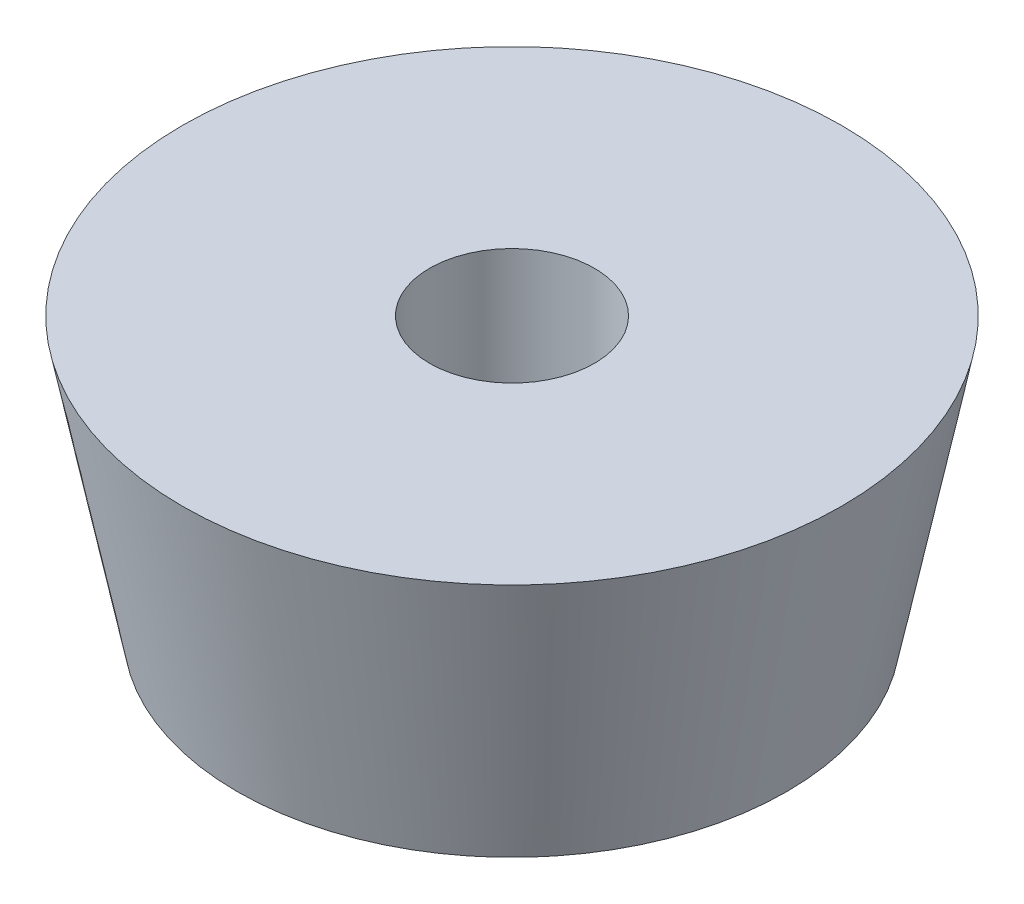
ISO-10303-21;
HEADER;
FILE_DESCRIPTION(('STEP AP214'),'2;1');
FILE_NAME('part.step','',(''),(''),'','','');
FILE_SCHEMA(('AUTOMOTIVE_DESIGN { 1 0 10303 214 1 1 1 1 }'));
ENDSEC;
DATA;
#1=APPLICATION_CONTEXT('core data for automotive mechanical design processes');
#2=APPLICATION_PROTOCOL_DEFINITION('international standard','automotive_design',2000,#1);
#3=PRODUCT_CONTEXT('',#1,'mechanical');
#4=PRODUCT('Part','Part','',(#3));
#5=PRODUCT_RELATED_PRODUCT_CATEGORY('part','',(#4));
#6=PRODUCT_DEFINITION_FORMATION('','',#4);
#7=PRODUCT_DEFINITION_CONTEXT('part definition',#1,'design');
#8=PRODUCT_DEFINITION('design','',#6,#7);
#9=PRODUCT_DEFINITION_SHAPE('','',#8);
#10=(LENGTH_UNIT() NAMED_UNIT(*) SI_UNIT(.MILLI.,.METRE.));
#11=(NAMED_UNIT(*) PLANE_ANGLE_UNIT() SI_UNIT($,.RADIAN.));
#12=(NAMED_UNIT(*) SI_UNIT($,.STERADIAN.) SOLID_ANGLE_UNIT());
#13=UNCERTAINTY_MEASURE_WITH_UNIT(LENGTH_MEASURE(1.E-05),#10,'distance_accuracy_value','');
#14=(GEOMETRIC_REPRESENTATION_CONTEXT(3) GLOBAL_UNCERTAINTY_ASSIGNED_CONTEXT((#13)) GLOBAL_UNIT_ASSIGNED_CONTEXT((#10,
#11,#12)) REPRESENTATION_CONTEXT('',''));
#15=CARTESIAN_POINT('',(0.,0.,0.));
#16=DIRECTION('',(0.,0.,1.));
#17=DIRECTION('',(1.,0.,0.));
#18=AXIS2_PLACEMENT_3D('',#15,#16,#17);
#19=CARTESIAN_POINT('',(0.,7.92957671305544,0.));
#20=DIRECTION('',(0.,1.,0.));
#21=DIRECTION('',(0.,0.,1.));
#22=AXIS2_PLACEMENT_3D('',#19,#20,#21);
#23=CYLINDRICAL_SURFACE('',#22,1.5);
#24=CARTESIAN_POINT('',(0.,0.,0.));
#25=DIRECTION('',(0.,1.,0.));
#26=DIRECTION('',(0.,0.,1.));
#27=AXIS2_PLACEMENT_3D('',#24,#25,#26);
#28=CIRCLE('',#27,1.5);
#29=CARTESIAN_POINT('',(0.,0.,1.5));
#30=VERTEX_POINT('',#29);
#31=EDGE_CURVE('E10',#30,#30,#28,.T.);
#32=ORIENTED_EDGE('',*,*,#31,.F.);
#33=EDGE_LOOP('',(#32));
#34=FACE_BOUND('',#33,.T.);
#35=CARTESIAN_POINT('',(0.,5.,0.));
#36=DIRECTION('',(0.,1.,0.));
#37=DIRECTION('',(0.,0.,1.));
#38=AXIS2_PLACEMENT_3D('',#35,#36,#37);
#39=CIRCLE('',#38,1.5);
#40=CARTESIAN_POINT('',(0.,5.,1.5));
#41=VERTEX_POINT('',#40);
#42=EDGE_CURVE('E54',#41,#41,#39,.T.);
#43=ORIENTED_EDGE('',*,*,#42,.T.);
#44=EDGE_LOOP('',(#43));
#45=FACE_BOUND('',#44,.T.);
#46=ADVANCED_FACE('F37',(#34,#45),#23,.F.);
#47=CARTESIAN_POINT('',(1.5,0.,0.));
#48=DIRECTION('',(0.,1.,0.));
#49=DIRECTION('',(0.,0.,1.));
#50=AXIS2_PLACEMENT_3D('',#47,#48,#49);
#51=PLANE('',#50);
#52=CARTESIAN_POINT('',(0.,0.,0.));
#53=DIRECTION('',(0.,1.,0.));
#54=DIRECTION('',(0.,0.,1.));
#55=AXIS2_PLACEMENT_3D('',#52,#53,#54);
#56=CIRCLE('',#55,5.);
#57=CARTESIAN_POINT('',(0.,0.,5.));
#58=VERTEX_POINT('',#57);
#59=EDGE_CURVE('E44',#58,#58,#56,.T.);
#60=ORIENTED_EDGE('',*,*,#59,.F.);
#61=EDGE_LOOP('',(#60));
#62=FACE_BOUND('',#61,.T.);
#63=ORIENTED_EDGE('',*,*,#31,.T.);
#64=EDGE_LOOP('',(#63));
#65=FACE_BOUND('',#64,.T.);
#66=ADVANCED_FACE('F70',(#62,#65),#51,.F.);
#67=CARTESIAN_POINT('',(0.,0.,0.));
#68=DIRECTION('',(0.,1.,0.));
#69=DIRECTION('',(0.,0.,1.));
#70=AXIS2_PLACEMENT_3D('',#67,#68,#69);
#71=CONICAL_SURFACE('',#70,5.,0.197396738400555);
#72=CARTESIAN_POINT('',(0.,5.,0.));
#73=DIRECTION('',(0.,1.,0.));
#74=DIRECTION('',(0.,0.,1.));
#75=AXIS2_PLACEMENT_3D('',#72,#73,#74);
#76=CIRCLE('',#75,6.00000612846495);
#77=CARTESIAN_POINT('',(0.,5.,6.00000612846495));
#78=VERTEX_POINT('',#77);
#79=EDGE_CURVE('E49',#78,#78,#76,.T.);
#80=ORIENTED_EDGE('',*,*,#79,.F.);
#81=EDGE_LOOP('',(#80));
#82=FACE_BOUND('',#81,.T.);
#83=ORIENTED_EDGE('',*,*,#59,.T.);
#84=EDGE_LOOP('',(#83));
#85=FACE_BOUND('',#84,.T.);
#86=ADVANCED_FACE('F65',(#82,#85),#71,.T.);
#87=CARTESIAN_POINT('',(6.00000612846495,5.,0.));
#88=DIRECTION('',(0.,-1.,0.));
#89=DIRECTION('',(0.,0.,-1.));
#90=AXIS2_PLACEMENT_3D('',#87,#88,#89);
#91=PLANE('',#90);
#92=ORIENTED_EDGE('',*,*,#42,.F.);
#93=EDGE_LOOP('',(#92));
#94=FACE_BOUND('',#93,.T.);
#95=ORIENTED_EDGE('',*,*,#79,.T.);
#96=EDGE_LOOP('',(#95));
#97=FACE_BOUND('',#96,.T.);
#98=ADVANCED_FACE('F62',(#94,#97),#91,.F.);
#99=CLOSED_SHELL('',(#46,#66,#86,#98));
#100=MANIFOLD_SOLID_BREP('B2',#99);
#101=ADVANCED_BREP_SHAPE_REPRESENTATION('',(#18,#100),#14);
#102=SHAPE_DEFINITION_REPRESENTATION(#9,#101);
ENDSEC;
END-ISO-10303-21;
